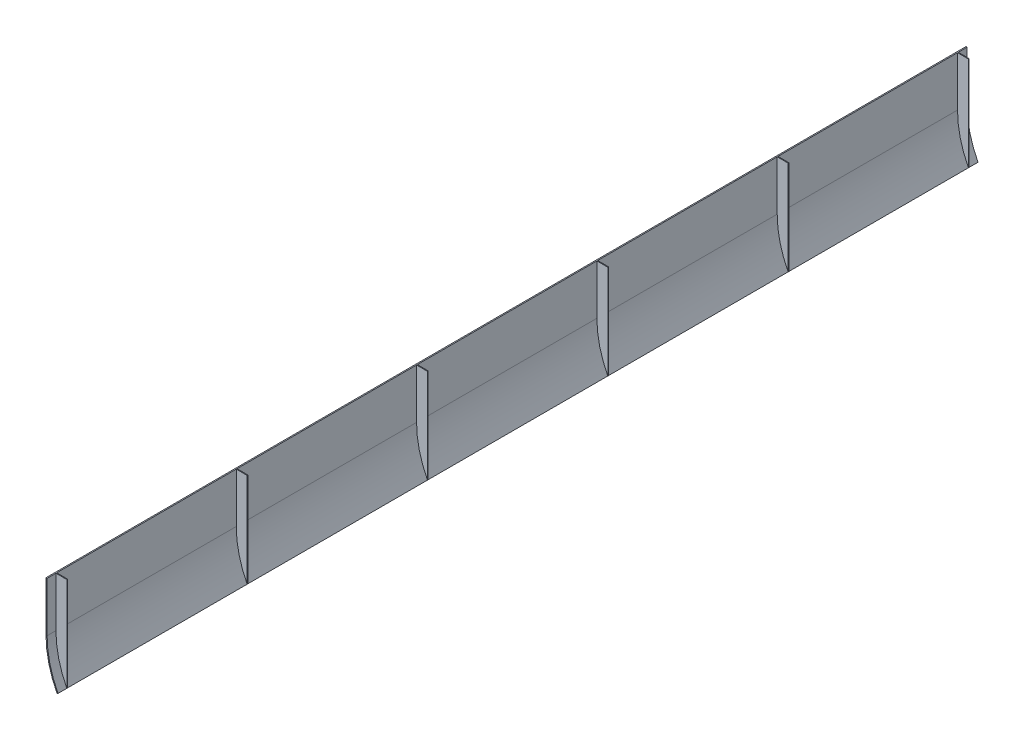
ISO-10303-21;
HEADER;
FILE_DESCRIPTION(('STEP AP214'),'2;1');
FILE_NAME('part.step','',(''),(''),'','','');
FILE_SCHEMA(('AUTOMOTIVE_DESIGN { 1 0 10303 214 1 1 1 1 }'));
ENDSEC;
DATA;
#1=APPLICATION_CONTEXT('core data for automotive mechanical design processes');
#2=APPLICATION_PROTOCOL_DEFINITION('international standard','automotive_design',2000,#1);
#3=PRODUCT_CONTEXT('',#1,'mechanical');
#4=PRODUCT('Part','Part','',(#3));
#5=PRODUCT_RELATED_PRODUCT_CATEGORY('part','',(#4));
#6=PRODUCT_DEFINITION_FORMATION('','',#4);
#7=PRODUCT_DEFINITION_CONTEXT('part definition',#1,'design');
#8=PRODUCT_DEFINITION('design','',#6,#7);
#9=PRODUCT_DEFINITION_SHAPE('','',#8);
#10=(LENGTH_UNIT() NAMED_UNIT(*) SI_UNIT(.MILLI.,.METRE.));
#11=(NAMED_UNIT(*) PLANE_ANGLE_UNIT() SI_UNIT($,.RADIAN.));
#12=(NAMED_UNIT(*) SI_UNIT($,.STERADIAN.) SOLID_ANGLE_UNIT());
#13=UNCERTAINTY_MEASURE_WITH_UNIT(LENGTH_MEASURE(1.E-05),#10,'distance_accuracy_value','');
#14=(GEOMETRIC_REPRESENTATION_CONTEXT(3) GLOBAL_UNCERTAINTY_ASSIGNED_CONTEXT((#13)) GLOBAL_UNIT_ASSIGNED_CONTEXT((#10,
#11,#12)) REPRESENTATION_CONTEXT('',''));
#15=CARTESIAN_POINT('',(0.,0.,0.));
#16=DIRECTION('',(0.,0.,1.));
#17=DIRECTION('',(1.,0.,0.));
#18=AXIS2_PLACEMENT_3D('',#15,#16,#17);
#19=CARTESIAN_POINT('',(234.72,122.4058822116,0.));
#20=DIRECTION('',(0.,0.,1.));
#21=DIRECTION('',(1.,0.,0.));
#22=AXIS2_PLACEMENT_3D('',#19,#20,#21);
#23=CYLINDRICAL_SURFACE('',#22,261.72);
#24=CARTESIAN_POINT('',(234.72,122.4058822116,24.));
#25=DIRECTION('',(0.,0.,-1.));
#26=DIRECTION('',(-1.,0.,0.));
#27=AXIS2_PLACEMENT_3D('',#24,#25,#26);
#28=CIRCLE('',#27,261.72);
#29=CARTESIAN_POINT('',(-27.,122.4058822116,24.));
#30=VERTEX_POINT('',#29);
#31=CARTESIAN_POINT('',(2.66001813236624,1.38719268145519,24.));
#32=VERTEX_POINT('',#31);
#33=EDGE_CURVE('E328',#30,#32,#28,.F.);
#34=ORIENTED_EDGE('',*,*,#33,.T.);
#35=DIRECTION('',(0.,0.,1.));
#36=VECTOR('',#35,1.);
#37=CARTESIAN_POINT('',(2.66001813236624,1.38719268145519,0.));
#38=LINE('',#37,#36);
#39=CARTESIAN_POINT('',(2.66001813236624,1.38719268145519,0.));
#40=VERTEX_POINT('',#39);
#41=EDGE_CURVE('E276',#40,#32,#38,.T.);
#42=ORIENTED_EDGE('',*,*,#41,.F.);
#43=CARTESIAN_POINT('',(234.72,122.4058822116,0.));
#44=DIRECTION('',(0.,0.,1.));
#45=DIRECTION('',(1.,0.,0.));
#46=AXIS2_PLACEMENT_3D('',#43,#44,#45);
#47=CIRCLE('',#46,261.72);
#48=CARTESIAN_POINT('',(-27.,122.4058822116,0.));
#49=VERTEX_POINT('',#48);
#50=EDGE_CURVE('E273',#40,#49,#47,.F.);
#51=ORIENTED_EDGE('',*,*,#50,.T.);
#52=DIRECTION('',(0.,0.,1.));
#53=VECTOR('',#52,1.);
#54=CARTESIAN_POINT('',(-27.,122.4058822116,0.));
#55=LINE('',#54,#53);
#56=EDGE_CURVE('E272',#49,#30,#55,.T.);
#57=ORIENTED_EDGE('',*,*,#56,.T.);
#58=EDGE_LOOP('',(#34,#42,#51,#57));
#59=FACE_BOUND('',#58,.T.);
#60=ADVANCED_FACE('F36',(#59),#23,.F.);
#61=CARTESIAN_POINT('',(-27.,122.4058822116,0.));
#62=DIRECTION('',(1.,0.,0.));
#63=DIRECTION('',(0.,1.,0.));
#64=AXIS2_PLACEMENT_3D('',#61,#62,#63);
#65=PLANE('',#64);
#66=DIRECTION('',(0.,1.,0.));
#67=VECTOR('',#66,1.);
#68=CARTESIAN_POINT('',(-27.,-0.002000000000002,24.));
#69=LINE('',#68,#67);
#70=CARTESIAN_POINT('',(-27.,257.4058822116,24.));
#71=VERTEX_POINT('',#70);
#72=EDGE_CURVE('E241',#30,#71,#69,.T.);
#73=ORIENTED_EDGE('',*,*,#72,.F.);
#74=ORIENTED_EDGE('',*,*,#56,.F.);
#75=DIRECTION('',(0.,1.,0.));
#76=VECTOR('',#75,1.);
#77=CARTESIAN_POINT('',(-27.,122.4058822116,0.));
#78=LINE('',#77,#76);
#79=CARTESIAN_POINT('',(-27.,257.4058822116,0.));
#80=VERTEX_POINT('',#79);
#81=EDGE_CURVE('E269',#49,#80,#78,.T.);
#82=ORIENTED_EDGE('',*,*,#81,.T.);
#83=DIRECTION('',(0.,0.,1.));
#84=VECTOR('',#83,1.);
#85=CARTESIAN_POINT('',(-27.,257.4058822116,0.));
#86=LINE('',#85,#84);
#87=EDGE_CURVE('E258',#80,#71,#86,.T.);
#88=ORIENTED_EDGE('',*,*,#87,.T.);
#89=EDGE_LOOP('',(#73,#74,#82,#88));
#90=FACE_BOUND('',#89,.T.);
#91=ADVANCED_FACE('F314',(#90),#65,.T.);
#92=CARTESIAN_POINT('',(234.72,122.4058822116,25.9999999999998));
#93=DIRECTION('',(0.,0.,1.));
#94=DIRECTION('',(1.,0.,0.));
#95=AXIS2_PLACEMENT_3D('',#92,#93,#94);
#96=CIRCLE('',#95,261.72);
#97=CARTESIAN_POINT('',(2.66001813236624,1.38719268145519,25.9999999999998));
#98=VERTEX_POINT('',#97);
#99=CARTESIAN_POINT('',(-27.,122.4058822116,25.9999999999998));
#100=VERTEX_POINT('',#99);
#101=EDGE_CURVE('E251',#98,#100,#96,.F.);
#102=ORIENTED_EDGE('',*,*,#101,.T.);
#103=CARTESIAN_POINT('',(-27.,122.4058822116,514.));
#104=VERTEX_POINT('',#103);
#105=EDGE_CURVE('E250',#100,#104,#55,.T.);
#106=ORIENTED_EDGE('',*,*,#105,.T.);
#107=CARTESIAN_POINT('',(234.72,122.4058822116,514.));
#108=DIRECTION('',(0.,0.,-1.));
#109=DIRECTION('',(-1.,0.,0.));
#110=AXIS2_PLACEMENT_3D('',#107,#108,#109);
#111=CIRCLE('',#110,261.72);
#112=CARTESIAN_POINT('',(2.66001813236624,1.38719268145519,514.));
#113=VERTEX_POINT('',#112);
#114=EDGE_CURVE('E350',#104,#113,#111,.F.);
#115=ORIENTED_EDGE('',*,*,#114,.T.);
#116=EDGE_CURVE('E279',#98,#113,#38,.T.);
#117=ORIENTED_EDGE('',*,*,#116,.F.);
#118=EDGE_LOOP('',(#102,#106,#115,#117));
#119=FACE_BOUND('',#118,.T.);
#120=ADVANCED_FACE('F494',(#119),#23,.F.);
#121=DIRECTION('',(0.,1.,0.));
#122=VECTOR('',#121,1.);
#123=CARTESIAN_POINT('',(-27.,-0.002000000000002,25.9999999999998));
#124=LINE('',#123,#122);
#125=CARTESIAN_POINT('',(-27.,257.4058822116,25.9999999999998));
#126=VERTEX_POINT('',#125);
#127=EDGE_CURVE('E236',#100,#126,#124,.T.);
#128=ORIENTED_EDGE('',*,*,#127,.T.);
#129=CARTESIAN_POINT('',(-27.,257.4058822116,514.));
#130=VERTEX_POINT('',#129);
#131=EDGE_CURVE('E248',#126,#130,#86,.T.);
#132=ORIENTED_EDGE('',*,*,#131,.T.);
#133=DIRECTION('',(0.,1.,0.));
#134=VECTOR('',#133,1.);
#135=CARTESIAN_POINT('',(-27.,-0.002000000000002,514.));
#136=LINE('',#135,#134);
#137=EDGE_CURVE('E338',#104,#130,#136,.T.);
#138=ORIENTED_EDGE('',*,*,#137,.F.);
#139=ORIENTED_EDGE('',*,*,#105,.F.);
#140=EDGE_LOOP('',(#128,#132,#138,#139));
#141=FACE_BOUND('',#140,.T.);
#142=ADVANCED_FACE('F246',(#141),#65,.T.);
#143=CARTESIAN_POINT('',(234.72,122.4058822116,516.));
#144=DIRECTION('',(0.,0.,1.));
#145=DIRECTION('',(1.,0.,0.));
#146=AXIS2_PLACEMENT_3D('',#143,#144,#145);
#147=CIRCLE('',#146,261.72);
#148=CARTESIAN_POINT('',(2.66001813236624,1.38719268145519,516.));
#149=VERTEX_POINT('',#148);
#150=CARTESIAN_POINT('',(-27.,122.4058822116,516.));
#151=VERTEX_POINT('',#150);
#152=EDGE_CURVE('E349',#149,#151,#147,.F.);
#153=ORIENTED_EDGE('',*,*,#152,.T.);
#154=CARTESIAN_POINT('',(-27.,122.4058822116,1004.));
#155=VERTEX_POINT('',#154);
#156=EDGE_CURVE('E495',#151,#155,#55,.T.);
#157=ORIENTED_EDGE('',*,*,#156,.T.);
#158=CARTESIAN_POINT('',(234.72,122.4058822116,1004.));
#159=DIRECTION('',(0.,0.,-1.));
#160=DIRECTION('',(-1.,0.,0.));
#161=AXIS2_PLACEMENT_3D('',#158,#159,#160);
#162=CIRCLE('',#161,261.72);
#163=CARTESIAN_POINT('',(2.66001813236624,1.38719268145519,1004.));
#164=VERTEX_POINT('',#163);
#165=EDGE_CURVE('E378',#155,#164,#162,.F.);
#166=ORIENTED_EDGE('',*,*,#165,.T.);
#167=EDGE_CURVE('E481',#149,#164,#38,.T.);
#168=ORIENTED_EDGE('',*,*,#167,.F.);
#169=EDGE_LOOP('',(#153,#157,#166,#168));
#170=FACE_BOUND('',#169,.T.);
#171=ADVANCED_FACE('F549',(#170),#23,.F.);
#172=DIRECTION('',(0.,1.,0.));
#173=VECTOR('',#172,1.);
#174=CARTESIAN_POINT('',(-27.,-0.002000000000002,516.));
#175=LINE('',#174,#173);
#176=CARTESIAN_POINT('',(-27.,257.4058822116,516.));
#177=VERTEX_POINT('',#176);
#178=EDGE_CURVE('E346',#151,#177,#175,.T.);
#179=ORIENTED_EDGE('',*,*,#178,.T.);
#180=CARTESIAN_POINT('',(-27.,257.4058822116,1004.));
#181=VERTEX_POINT('',#180);
#182=EDGE_CURVE('E259',#177,#181,#86,.T.);
#183=ORIENTED_EDGE('',*,*,#182,.T.);
#184=DIRECTION('',(0.,1.,0.));
#185=VECTOR('',#184,1.);
#186=CARTESIAN_POINT('',(-27.,-0.002000000000002,1004.));
#187=LINE('',#186,#185);
#188=EDGE_CURVE('E362',#155,#181,#187,.T.);
#189=ORIENTED_EDGE('',*,*,#188,.F.);
#190=ORIENTED_EDGE('',*,*,#156,.F.);
#191=EDGE_LOOP('',(#179,#183,#189,#190));
#192=FACE_BOUND('',#191,.T.);
#193=ADVANCED_FACE('F573',(#192),#65,.T.);
#194=CARTESIAN_POINT('',(234.72,122.4058822116,1006.));
#195=DIRECTION('',(0.,0.,1.));
#196=DIRECTION('',(1.,0.,0.));
#197=AXIS2_PLACEMENT_3D('',#194,#195,#196);
#198=CIRCLE('',#197,261.72);
#199=CARTESIAN_POINT('',(2.66001813236624,1.38719268145519,1006.));
#200=VERTEX_POINT('',#199);
#201=CARTESIAN_POINT('',(-27.,122.4058822116,1006.));
#202=VERTEX_POINT('',#201);
#203=EDGE_CURVE('E377',#200,#202,#198,.F.);
#204=ORIENTED_EDGE('',*,*,#203,.T.);
#205=CARTESIAN_POINT('',(-27.,122.4058822116,1494.));
#206=VERTEX_POINT('',#205);
#207=EDGE_CURVE('E496',#202,#206,#55,.T.);
#208=ORIENTED_EDGE('',*,*,#207,.T.);
#209=CARTESIAN_POINT('',(234.72,122.4058822116,1494.));
#210=DIRECTION('',(0.,0.,-1.));
#211=DIRECTION('',(-1.,0.,0.));
#212=AXIS2_PLACEMENT_3D('',#209,#210,#211);
#213=CIRCLE('',#212,261.72);
#214=CARTESIAN_POINT('',(2.66001813236624,1.38719268145519,1494.));
#215=VERTEX_POINT('',#214);
#216=EDGE_CURVE('E406',#206,#215,#213,.F.);
#217=ORIENTED_EDGE('',*,*,#216,.T.);
#218=EDGE_CURVE('E478',#200,#215,#38,.T.);
#219=ORIENTED_EDGE('',*,*,#218,.F.);
#220=EDGE_LOOP('',(#204,#208,#217,#219));
#221=FACE_BOUND('',#220,.T.);
#222=ADVANCED_FACE('F568',(#221),#23,.F.);
#223=DIRECTION('',(0.,1.,0.));
#224=VECTOR('',#223,1.);
#225=CARTESIAN_POINT('',(-27.,-0.002000000000002,1006.));
#226=LINE('',#225,#224);
#227=CARTESIAN_POINT('',(-27.,257.4058822116,1006.));
#228=VERTEX_POINT('',#227);
#229=EDGE_CURVE('E374',#202,#228,#226,.T.);
#230=ORIENTED_EDGE('',*,*,#229,.T.);
#231=CARTESIAN_POINT('',(-27.,257.4058822116,1494.));
#232=VERTEX_POINT('',#231);
#233=EDGE_CURVE('E264',#228,#232,#86,.T.);
#234=ORIENTED_EDGE('',*,*,#233,.T.);
#235=DIRECTION('',(0.,1.,0.));
#236=VECTOR('',#235,1.);
#237=CARTESIAN_POINT('',(-27.,-0.002000000000002,1494.));
#238=LINE('',#237,#236);
#239=EDGE_CURVE('E390',#206,#232,#238,.T.);
#240=ORIENTED_EDGE('',*,*,#239,.F.);
#241=ORIENTED_EDGE('',*,*,#207,.F.);
#242=EDGE_LOOP('',(#230,#234,#240,#241));
#243=FACE_BOUND('',#242,.T.);
#244=ADVANCED_FACE('F566',(#243),#65,.T.);
#245=CARTESIAN_POINT('',(234.72,122.4058822116,1496.));
#246=DIRECTION('',(0.,0.,1.));
#247=DIRECTION('',(1.,0.,0.));
#248=AXIS2_PLACEMENT_3D('',#245,#246,#247);
#249=CIRCLE('',#248,261.72);
#250=CARTESIAN_POINT('',(2.66001813236624,1.38719268145519,1496.));
#251=VERTEX_POINT('',#250);
#252=CARTESIAN_POINT('',(-27.,122.4058822116,1496.));
#253=VERTEX_POINT('',#252);
#254=EDGE_CURVE('E405',#251,#253,#249,.F.);
#255=ORIENTED_EDGE('',*,*,#254,.T.);
#256=CARTESIAN_POINT('',(-27.,122.4058822116,1984.));
#257=VERTEX_POINT('',#256);
#258=EDGE_CURVE('E500',#253,#257,#55,.T.);
#259=ORIENTED_EDGE('',*,*,#258,.T.);
#260=CARTESIAN_POINT('',(234.72,122.4058822116,1984.));
#261=DIRECTION('',(0.,0.,-1.));
#262=DIRECTION('',(-1.,0.,0.));
#263=AXIS2_PLACEMENT_3D('',#260,#261,#262);
#264=CIRCLE('',#263,261.72);
#265=CARTESIAN_POINT('',(2.66001813236624,1.38719268145519,1984.));
#266=VERTEX_POINT('',#265);
#267=EDGE_CURVE('E434',#257,#266,#264,.F.);
#268=ORIENTED_EDGE('',*,*,#267,.T.);
#269=EDGE_CURVE('E476',#251,#266,#38,.T.);
#270=ORIENTED_EDGE('',*,*,#269,.F.);
#271=EDGE_LOOP('',(#255,#259,#268,#270));
#272=FACE_BOUND('',#271,.T.);
#273=ADVANCED_FACE('F559',(#272),#23,.F.);
#274=DIRECTION('',(0.,1.,0.));
#275=VECTOR('',#274,1.);
#276=CARTESIAN_POINT('',(-27.,-0.002000000000002,1496.));
#277=LINE('',#276,#275);
#278=CARTESIAN_POINT('',(-27.,257.4058822116,1496.));
#279=VERTEX_POINT('',#278);
#280=EDGE_CURVE('E402',#253,#279,#277,.T.);
#281=ORIENTED_EDGE('',*,*,#280,.T.);
#282=CARTESIAN_POINT('',(-27.,257.4058822116,1984.));
#283=VERTEX_POINT('',#282);
#284=EDGE_CURVE('E602',#279,#283,#86,.T.);
#285=ORIENTED_EDGE('',*,*,#284,.T.);
#286=DIRECTION('',(0.,1.,0.));
#287=VECTOR('',#286,1.);
#288=CARTESIAN_POINT('',(-27.,-0.002000000000002,1984.));
#289=LINE('',#288,#287);
#290=EDGE_CURVE('E418',#257,#283,#289,.T.);
#291=ORIENTED_EDGE('',*,*,#290,.F.);
#292=ORIENTED_EDGE('',*,*,#258,.F.);
#293=EDGE_LOOP('',(#281,#285,#291,#292));
#294=FACE_BOUND('',#293,.T.);
#295=ADVANCED_FACE('F558',(#294),#65,.T.);
#296=CARTESIAN_POINT('',(234.72,122.4058822116,1986.));
#297=DIRECTION('',(0.,0.,1.));
#298=DIRECTION('',(1.,0.,0.));
#299=AXIS2_PLACEMENT_3D('',#296,#297,#298);
#300=CIRCLE('',#299,261.72);
#301=CARTESIAN_POINT('',(2.66001813236624,1.38719268145519,1986.));
#302=VERTEX_POINT('',#301);
#303=CARTESIAN_POINT('',(-27.,122.4058822116,1986.));
#304=VERTEX_POINT('',#303);
#305=EDGE_CURVE('E433',#302,#304,#300,.F.);
#306=ORIENTED_EDGE('',*,*,#305,.T.);
#307=CARTESIAN_POINT('',(-27.,122.4058822116,2474.));
#308=VERTEX_POINT('',#307);
#309=EDGE_CURVE('E504',#304,#308,#55,.T.);
#310=ORIENTED_EDGE('',*,*,#309,.T.);
#311=CARTESIAN_POINT('',(234.72,122.4058822116,2474.));
#312=DIRECTION('',(0.,0.,-1.));
#313=DIRECTION('',(-1.,0.,0.));
#314=AXIS2_PLACEMENT_3D('',#311,#312,#313);
#315=CIRCLE('',#314,261.72);
#316=CARTESIAN_POINT('',(2.66001813236624,1.38719268145519,2474.));
#317=VERTEX_POINT('',#316);
#318=EDGE_CURVE('E296',#308,#317,#315,.F.);
#319=ORIENTED_EDGE('',*,*,#318,.T.);
#320=EDGE_CURVE('E474',#302,#317,#38,.T.);
#321=ORIENTED_EDGE('',*,*,#320,.F.);
#322=EDGE_LOOP('',(#306,#310,#319,#321));
#323=FACE_BOUND('',#322,.T.);
#324=ADVANCED_FACE('F551',(#323),#23,.F.);
#325=DIRECTION('',(0.,1.,0.));
#326=VECTOR('',#325,1.);
#327=CARTESIAN_POINT('',(-27.,-0.002000000000002,1986.));
#328=LINE('',#327,#326);
#329=CARTESIAN_POINT('',(-27.,257.4058822116,1986.));
#330=VERTEX_POINT('',#329);
#331=EDGE_CURVE('E430',#304,#330,#328,.T.);
#332=ORIENTED_EDGE('',*,*,#331,.T.);
#333=CARTESIAN_POINT('',(-27.,257.4058822116,2474.));
#334=VERTEX_POINT('',#333);
#335=EDGE_CURVE('E520',#330,#334,#86,.T.);
#336=ORIENTED_EDGE('',*,*,#335,.T.);
#337=DIRECTION('',(0.,1.,0.));
#338=VECTOR('',#337,1.);
#339=CARTESIAN_POINT('',(-27.,-0.002000000000002,2474.));
#340=LINE('',#339,#338);
#341=EDGE_CURVE('E446',#308,#334,#340,.T.);
#342=ORIENTED_EDGE('',*,*,#341,.F.);
#343=ORIENTED_EDGE('',*,*,#309,.F.);
#344=EDGE_LOOP('',(#332,#336,#342,#343));
#345=FACE_BOUND('',#344,.T.);
#346=ADVANCED_FACE('F556',(#345),#65,.T.);
#347=CARTESIAN_POINT('',(-30.,122.4058822116,0.));
#348=DIRECTION('',(0.,0.,-1.));
#349=DIRECTION('',(0.,1.,0.));
#350=AXIS2_PLACEMENT_3D('',#347,#348,#349);
#351=PLANE('',#350);
#352=ORIENTED_EDGE('',*,*,#81,.F.);
#353=ORIENTED_EDGE('',*,*,#50,.F.);
#354=DIRECTION('',(0.886672710788758,0.46239756048504,0.));
#355=VECTOR('',#354,1.);
#356=CARTESIAN_POINT('',(0.,0.,0.));
#357=LINE('',#356,#355);
#358=CARTESIAN_POINT('',(0.,0.,0.));
#359=VERTEX_POINT('',#358);
#360=EDGE_CURVE('E11',#359,#40,#357,.T.);
#361=ORIENTED_EDGE('',*,*,#360,.F.);
#362=CARTESIAN_POINT('',(234.72,122.4058822116,0.));
#363=DIRECTION('',(0.,0.,-1.));
#364=DIRECTION('',(-1.,0.,0.));
#365=AXIS2_PLACEMENT_3D('',#362,#363,#364);
#366=CIRCLE('',#365,264.72);
#367=CARTESIAN_POINT('',(-30.,122.4058822116,0.));
#368=VERTEX_POINT('',#367);
#369=EDGE_CURVE('E281',#359,#368,#366,.T.);
#370=ORIENTED_EDGE('',*,*,#369,.T.);
#371=DIRECTION('',(0.,1.,0.));
#372=VECTOR('',#371,1.);
#373=CARTESIAN_POINT('',(-30.,122.4058822116,0.));
#374=LINE('',#373,#372);
#375=CARTESIAN_POINT('',(-30.,257.4058822116,0.));
#376=VERTEX_POINT('',#375);
#377=EDGE_CURVE('E285',#368,#376,#374,.T.);
#378=ORIENTED_EDGE('',*,*,#377,.T.);
#379=DIRECTION('',(1.,0.,0.));
#380=VECTOR('',#379,1.);
#381=CARTESIAN_POINT('',(-30.,257.4058822116,0.));
#382=LINE('',#381,#380);
#383=EDGE_CURVE('E45',#376,#80,#382,.T.);
#384=ORIENTED_EDGE('',*,*,#383,.T.);
#385=EDGE_LOOP('',(#352,#353,#361,#370,#378,#384));
#386=FACE_BOUND('',#385,.T.);
#387=ADVANCED_FACE('F306',(#386),#351,.T.);
#388=CARTESIAN_POINT('',(-30.,257.4058822116,0.));
#389=DIRECTION('',(0.,1.,0.));
#390=DIRECTION('',(0.,0.,1.));
#391=AXIS2_PLACEMENT_3D('',#388,#389,#390);
#392=PLANE('',#391);
#393=ORIENTED_EDGE('',*,*,#383,.F.);
#394=DIRECTION('',(0.,0.,1.));
#395=VECTOR('',#394,1.);
#396=CARTESIAN_POINT('',(-30.,257.4058822116,0.));
#397=LINE('',#396,#395);
#398=CARTESIAN_POINT('',(-30.,257.4058822116,2500.));
#399=VERTEX_POINT('',#398);
#400=EDGE_CURVE('E288',#376,#399,#397,.T.);
#401=ORIENTED_EDGE('',*,*,#400,.T.);
#402=DIRECTION('',(1.,0.,0.));
#403=VECTOR('',#402,1.);
#404=CARTESIAN_POINT('',(-30.,257.4058822116,2500.));
#405=LINE('',#404,#403);
#406=CARTESIAN_POINT('',(-27.,257.4058822116,2500.));
#407=VERTEX_POINT('',#406);
#408=EDGE_CURVE('E302',#399,#407,#405,.T.);
#409=ORIENTED_EDGE('',*,*,#408,.T.);
#410=CARTESIAN_POINT('',(-27.,257.4058822116,2476.));
#411=VERTEX_POINT('',#410);
#412=EDGE_CURVE('E263',#411,#407,#86,.T.);
#413=ORIENTED_EDGE('',*,*,#412,.F.);
#414=DIRECTION('',(1.,0.,0.));
#415=VECTOR('',#414,1.);
#416=CARTESIAN_POINT('',(-27.,257.4058822116,2476.));
#417=LINE('',#416,#415);
#418=CARTESIAN_POINT('',(2.66001813236624,257.4058822116,2476.));
#419=VERTEX_POINT('',#418);
#420=EDGE_CURVE('E443',#411,#419,#417,.T.);
#421=ORIENTED_EDGE('',*,*,#420,.T.);
#422=DIRECTION('',(0.,0.,-1.));
#423=VECTOR('',#422,1.);
#424=CARTESIAN_POINT('',(2.66001813236624,257.4058822116,2476.));
#425=LINE('',#424,#423);
#426=CARTESIAN_POINT('',(2.66001813236624,257.4058822116,2474.));
#427=VERTEX_POINT('',#426);
#428=EDGE_CURVE('E447',#419,#427,#425,.T.);
#429=ORIENTED_EDGE('',*,*,#428,.T.);
#430=DIRECTION('',(-1.,0.,0.));
#431=VECTOR('',#430,1.);
#432=CARTESIAN_POINT('',(-27.,257.4058822116,2474.));
#433=LINE('',#432,#431);
#434=EDGE_CURVE('E437',#427,#334,#433,.T.);
#435=ORIENTED_EDGE('',*,*,#434,.T.);
#436=ORIENTED_EDGE('',*,*,#335,.F.);
#437=DIRECTION('',(1.,0.,0.));
#438=VECTOR('',#437,1.);
#439=CARTESIAN_POINT('',(-27.,257.4058822116,1986.));
#440=LINE('',#439,#438);
#441=CARTESIAN_POINT('',(2.66001813236624,257.4058822116,1986.));
#442=VERTEX_POINT('',#441);
#443=EDGE_CURVE('E415',#330,#442,#440,.T.);
#444=ORIENTED_EDGE('',*,*,#443,.T.);
#445=DIRECTION('',(0.,0.,-1.));
#446=VECTOR('',#445,1.);
#447=CARTESIAN_POINT('',(2.66001813236624,257.4058822116,1986.));
#448=LINE('',#447,#446);
#449=CARTESIAN_POINT('',(2.66001813236624,257.4058822116,1984.));
#450=VERTEX_POINT('',#449);
#451=EDGE_CURVE('E419',#442,#450,#448,.T.);
#452=ORIENTED_EDGE('',*,*,#451,.T.);
#453=DIRECTION('',(-1.,0.,0.));
#454=VECTOR('',#453,1.);
#455=CARTESIAN_POINT('',(-27.,257.4058822116,1984.));
#456=LINE('',#455,#454);
#457=EDGE_CURVE('E409',#450,#283,#456,.T.);
#458=ORIENTED_EDGE('',*,*,#457,.T.);
#459=ORIENTED_EDGE('',*,*,#284,.F.);
#460=DIRECTION('',(1.,0.,0.));
#461=VECTOR('',#460,1.);
#462=CARTESIAN_POINT('',(-27.,257.4058822116,1496.));
#463=LINE('',#462,#461);
#464=CARTESIAN_POINT('',(2.66001813236624,257.4058822116,1496.));
#465=VERTEX_POINT('',#464);
#466=EDGE_CURVE('E387',#279,#465,#463,.T.);
#467=ORIENTED_EDGE('',*,*,#466,.T.);
#468=DIRECTION('',(0.,0.,-1.));
#469=VECTOR('',#468,1.);
#470=CARTESIAN_POINT('',(2.66001813236624,257.4058822116,1496.));
#471=LINE('',#470,#469);
#472=CARTESIAN_POINT('',(2.66001813236624,257.4058822116,1494.));
#473=VERTEX_POINT('',#472);
#474=EDGE_CURVE('E391',#465,#473,#471,.T.);
#475=ORIENTED_EDGE('',*,*,#474,.T.);
#476=DIRECTION('',(-1.,0.,0.));
#477=VECTOR('',#476,1.);
#478=CARTESIAN_POINT('',(-27.,257.4058822116,1494.));
#479=LINE('',#478,#477);
#480=EDGE_CURVE('E381',#473,#232,#479,.T.);
#481=ORIENTED_EDGE('',*,*,#480,.T.);
#482=ORIENTED_EDGE('',*,*,#233,.F.);
#483=DIRECTION('',(1.,0.,0.));
#484=VECTOR('',#483,1.);
#485=CARTESIAN_POINT('',(-27.,257.4058822116,1006.));
#486=LINE('',#485,#484);
#487=CARTESIAN_POINT('',(2.66001813236624,257.4058822116,1006.));
#488=VERTEX_POINT('',#487);
#489=EDGE_CURVE('E359',#228,#488,#486,.T.);
#490=ORIENTED_EDGE('',*,*,#489,.T.);
#491=DIRECTION('',(0.,0.,-1.));
#492=VECTOR('',#491,1.);
#493=CARTESIAN_POINT('',(2.66001813236624,257.4058822116,1006.));
#494=LINE('',#493,#492);
#495=CARTESIAN_POINT('',(2.66001813236624,257.4058822116,1004.));
#496=VERTEX_POINT('',#495);
#497=EDGE_CURVE('E363',#488,#496,#494,.T.);
#498=ORIENTED_EDGE('',*,*,#497,.T.);
#499=DIRECTION('',(-1.,0.,0.));
#500=VECTOR('',#499,1.);
#501=CARTESIAN_POINT('',(-27.,257.4058822116,1004.));
#502=LINE('',#501,#500);
#503=EDGE_CURVE('E353',#496,#181,#502,.T.);
#504=ORIENTED_EDGE('',*,*,#503,.T.);
#505=ORIENTED_EDGE('',*,*,#182,.F.);
#506=DIRECTION('',(1.,0.,0.));
#507=VECTOR('',#506,1.);
#508=CARTESIAN_POINT('',(-27.,257.4058822116,516.));
#509=LINE('',#508,#507);
#510=CARTESIAN_POINT('',(2.66001813236624,257.4058822116,516.));
#511=VERTEX_POINT('',#510);
#512=EDGE_CURVE('E335',#177,#511,#509,.T.);
#513=ORIENTED_EDGE('',*,*,#512,.T.);
#514=DIRECTION('',(0.,0.,-1.));
#515=VECTOR('',#514,1.);
#516=CARTESIAN_POINT('',(2.66001813236624,257.4058822116,516.));
#517=LINE('',#516,#515);
#518=CARTESIAN_POINT('',(2.66001813236624,257.4058822116,514.));
#519=VERTEX_POINT('',#518);
#520=EDGE_CURVE('E339',#511,#519,#517,.T.);
#521=ORIENTED_EDGE('',*,*,#520,.T.);
#522=DIRECTION('',(-1.,0.,0.));
#523=VECTOR('',#522,1.);
#524=CARTESIAN_POINT('',(-27.,257.4058822116,514.));
#525=LINE('',#524,#523);
#526=EDGE_CURVE('E257',#519,#130,#525,.T.);
#527=ORIENTED_EDGE('',*,*,#526,.T.);
#528=ORIENTED_EDGE('',*,*,#131,.F.);
#529=DIRECTION('',(1.,0.,0.));
#530=VECTOR('',#529,1.);
#531=CARTESIAN_POINT('',(-27.,257.4058822116,25.9999999999998));
#532=LINE('',#531,#530);
#533=CARTESIAN_POINT('',(2.66001813236624,257.4058822116,25.9999999999998));
#534=VERTEX_POINT('',#533);
#535=EDGE_CURVE('E233',#126,#534,#532,.T.);
#536=ORIENTED_EDGE('',*,*,#535,.T.);
#537=DIRECTION('',(0.,0.,-1.));
#538=VECTOR('',#537,1.);
#539=CARTESIAN_POINT('',(2.66001813236624,257.4058822116,25.9999999999998));
#540=LINE('',#539,#538);
#541=CARTESIAN_POINT('',(2.66001813236624,257.4058822116,24.));
#542=VERTEX_POINT('',#541);
#543=EDGE_CURVE('E242',#534,#542,#540,.T.);
#544=ORIENTED_EDGE('',*,*,#543,.T.);
#545=DIRECTION('',(-1.,0.,0.));
#546=VECTOR('',#545,1.);
#547=CARTESIAN_POINT('',(-27.,257.4058822116,24.));
#548=LINE('',#547,#546);
#549=EDGE_CURVE('E318',#542,#71,#548,.T.);
#550=ORIENTED_EDGE('',*,*,#549,.T.);
#551=ORIENTED_EDGE('',*,*,#87,.F.);
#552=EDGE_LOOP('',(#393,#401,#409,#413,#421,#429,#435,#436,#444,#452,#458,#459,#467,#475,#481,
#482,#490,#498,#504,#505,#513,#521,#527,#528,#536,#544,#550,#551));
#553=FACE_BOUND('',#552,.T.);
#554=ADVANCED_FACE('F254',(#553),#392,.T.);
#555=CARTESIAN_POINT('',(234.72,122.4058822116,2500.));
#556=DIRECTION('',(0.,0.,1.));
#557=DIRECTION('',(1.,0.,0.));
#558=AXIS2_PLACEMENT_3D('',#555,#556,#557);
#559=PLANE('',#558);
#560=CARTESIAN_POINT('',(234.72,122.4058822116,2500.));
#561=DIRECTION('',(0.,0.,1.));
#562=DIRECTION('',(1.,0.,0.));
#563=AXIS2_PLACEMENT_3D('',#560,#561,#562);
#564=CIRCLE('',#563,261.72);
#565=CARTESIAN_POINT('',(2.66001813236624,1.38719268145519,2500.));
#566=VERTEX_POINT('',#565);
#567=CARTESIAN_POINT('',(-27.,122.4058822116,2500.));
#568=VERTEX_POINT('',#567);
#569=EDGE_CURVE('E262',#566,#568,#564,.F.);
#570=ORIENTED_EDGE('',*,*,#569,.T.);
#571=DIRECTION('',(0.,1.,0.));
#572=VECTOR('',#571,1.);
#573=CARTESIAN_POINT('',(-27.,122.4058822116,2500.));
#574=LINE('',#573,#572);
#575=EDGE_CURVE('E267',#568,#407,#574,.T.);
#576=ORIENTED_EDGE('',*,*,#575,.T.);
#577=ORIENTED_EDGE('',*,*,#408,.F.);
#578=DIRECTION('',(0.,1.,0.));
#579=VECTOR('',#578,1.);
#580=CARTESIAN_POINT('',(-30.,122.4058822116,2500.));
#581=LINE('',#580,#579);
#582=CARTESIAN_POINT('',(-30.,122.4058822116,2500.));
#583=VERTEX_POINT('',#582);
#584=EDGE_CURVE('E293',#583,#399,#581,.T.);
#585=ORIENTED_EDGE('',*,*,#584,.F.);
#586=CARTESIAN_POINT('',(234.72,122.4058822116,2500.));
#587=DIRECTION('',(0.,0.,-1.));
#588=DIRECTION('',(-1.,0.,0.));
#589=AXIS2_PLACEMENT_3D('',#586,#587,#588);
#590=CIRCLE('',#589,264.72);
#591=CARTESIAN_POINT('',(0.,0.,2500.));
#592=VERTEX_POINT('',#591);
#593=EDGE_CURVE('E290',#592,#583,#590,.T.);
#594=ORIENTED_EDGE('',*,*,#593,.F.);
#595=DIRECTION('',(0.886672710788758,0.46239756048504,0.));
#596=VECTOR('',#595,1.);
#597=CARTESIAN_POINT('',(0.,0.,2500.));
#598=LINE('',#597,#596);
#599=EDGE_CURVE('E40',#592,#566,#598,.T.);
#600=ORIENTED_EDGE('',*,*,#599,.T.);
#601=EDGE_LOOP('',(#570,#576,#577,#585,#594,#600));
#602=FACE_BOUND('',#601,.T.);
#603=ADVANCED_FACE('F514',(#602),#559,.T.);
#604=CARTESIAN_POINT('',(0.,0.,1250.));
#605=DIRECTION('',(0.46239756048504,-0.886672710788758,0.));
#606=DIRECTION('',(0.,0.,1.));
#607=AXIS2_PLACEMENT_3D('',#604,#605,#606);
#608=PLANE('',#607);
#609=DIRECTION('',(0.,0.,1.));
#610=VECTOR('',#609,1.);
#611=CARTESIAN_POINT('',(0.,0.,0.));
#612=LINE('',#611,#610);
#613=EDGE_CURVE('E284',#359,#592,#612,.T.);
#614=ORIENTED_EDGE('',*,*,#613,.F.);
#615=ORIENTED_EDGE('',*,*,#360,.T.);
#616=ORIENTED_EDGE('',*,*,#41,.T.);
#617=DIRECTION('',(0.,0.,1.));
#618=VECTOR('',#617,1.);
#619=CARTESIAN_POINT('',(2.66001813236624,1.38719268145519,0.));
#620=LINE('',#619,#618);
#621=EDGE_CURVE('E331',#32,#98,#620,.T.);
#622=ORIENTED_EDGE('',*,*,#621,.T.);
#623=ORIENTED_EDGE('',*,*,#116,.T.);
#624=DIRECTION('',(0.,0.,1.));
#625=VECTOR('',#624,1.);
#626=CARTESIAN_POINT('',(2.66001813236624,1.38719268145519,0.));
#627=LINE('',#626,#625);
#628=EDGE_CURVE('E354',#113,#149,#627,.T.);
#629=ORIENTED_EDGE('',*,*,#628,.T.);
#630=ORIENTED_EDGE('',*,*,#167,.T.);
#631=DIRECTION('',(0.,0.,1.));
#632=VECTOR('',#631,1.);
#633=CARTESIAN_POINT('',(2.66001813236624,1.38719268145519,0.));
#634=LINE('',#633,#632);
#635=EDGE_CURVE('E382',#164,#200,#634,.T.);
#636=ORIENTED_EDGE('',*,*,#635,.T.);
#637=ORIENTED_EDGE('',*,*,#218,.T.);
#638=DIRECTION('',(0.,0.,1.));
#639=VECTOR('',#638,1.);
#640=CARTESIAN_POINT('',(2.66001813236624,1.38719268145519,0.));
#641=LINE('',#640,#639);
#642=EDGE_CURVE('E410',#215,#251,#641,.T.);
#643=ORIENTED_EDGE('',*,*,#642,.T.);
#644=ORIENTED_EDGE('',*,*,#269,.T.);
#645=DIRECTION('',(0.,0.,1.));
#646=VECTOR('',#645,1.);
#647=CARTESIAN_POINT('',(2.66001813236624,1.38719268145519,0.));
#648=LINE('',#647,#646);
#649=EDGE_CURVE('E438',#266,#302,#648,.T.);
#650=ORIENTED_EDGE('',*,*,#649,.T.);
#651=ORIENTED_EDGE('',*,*,#320,.T.);
#652=DIRECTION('',(0.,0.,1.));
#653=VECTOR('',#652,1.);
#654=CARTESIAN_POINT('',(2.66001813236624,1.38719268145519,0.));
#655=LINE('',#654,#653);
#656=CARTESIAN_POINT('',(2.66001813236624,1.38719268145519,2476.));
#657=VERTEX_POINT('',#656);
#658=EDGE_CURVE('E464',#317,#657,#655,.T.);
#659=ORIENTED_EDGE('',*,*,#658,.T.);
#660=EDGE_CURVE('E280',#657,#566,#38,.T.);
#661=ORIENTED_EDGE('',*,*,#660,.T.);
#662=ORIENTED_EDGE('',*,*,#599,.F.);
#663=EDGE_LOOP('',(#614,#615,#616,#622,#623,#629,#630,#636,#637,#643,#644,#650,#651,#659,#661,#662));
#664=FACE_BOUND('',#663,.T.);
#665=ADVANCED_FACE('F38',(#664),#608,.T.);
#666=CARTESIAN_POINT('',(234.72,122.4058822116,2476.));
#667=DIRECTION('',(0.,0.,1.));
#668=DIRECTION('',(1.,0.,0.));
#669=AXIS2_PLACEMENT_3D('',#666,#667,#668);
#670=CIRCLE('',#669,261.72);
#671=CARTESIAN_POINT('',(-27.,122.4058822116,2476.));
#672=VERTEX_POINT('',#671);
#673=EDGE_CURVE('E461',#657,#672,#670,.F.);
#674=ORIENTED_EDGE('',*,*,#673,.T.);
#675=EDGE_CURVE('E468',#672,#568,#55,.T.);
#676=ORIENTED_EDGE('',*,*,#675,.T.);
#677=ORIENTED_EDGE('',*,*,#569,.F.);
#678=ORIENTED_EDGE('',*,*,#660,.F.);
#679=EDGE_LOOP('',(#674,#676,#677,#678));
#680=FACE_BOUND('',#679,.T.);
#681=ADVANCED_FACE('F542',(#680),#23,.F.);
#682=DIRECTION('',(0.,1.,0.));
#683=VECTOR('',#682,1.);
#684=CARTESIAN_POINT('',(-27.,-0.002000000000002,2476.));
#685=LINE('',#684,#683);
#686=EDGE_CURVE('E458',#672,#411,#685,.T.);
#687=ORIENTED_EDGE('',*,*,#686,.T.);
#688=ORIENTED_EDGE('',*,*,#412,.T.);
#689=ORIENTED_EDGE('',*,*,#575,.F.);
#690=ORIENTED_EDGE('',*,*,#675,.F.);
#691=EDGE_LOOP('',(#687,#688,#689,#690));
#692=FACE_BOUND('',#691,.T.);
#693=ADVANCED_FACE('F517',(#692),#65,.T.);
#694=CARTESIAN_POINT('',(234.72,122.4058822116,0.));
#695=DIRECTION('',(0.,0.,1.));
#696=DIRECTION('',(1.,0.,0.));
#697=AXIS2_PLACEMENT_3D('',#694,#695,#696);
#698=CYLINDRICAL_SURFACE('',#697,264.72);
#699=ORIENTED_EDGE('',*,*,#593,.T.);
#700=DIRECTION('',(0.,0.,1.));
#701=VECTOR('',#700,1.);
#702=CARTESIAN_POINT('',(-30.,122.4058822116,0.));
#703=LINE('',#702,#701);
#704=EDGE_CURVE('E289',#368,#583,#703,.T.);
#705=ORIENTED_EDGE('',*,*,#704,.F.);
#706=ORIENTED_EDGE('',*,*,#369,.F.);
#707=ORIENTED_EDGE('',*,*,#613,.T.);
#708=EDGE_LOOP('',(#699,#705,#706,#707));
#709=FACE_BOUND('',#708,.T.);
#710=ADVANCED_FACE('F525',(#709),#698,.T.);
#711=CARTESIAN_POINT('',(-30.,122.4058822116,0.));
#712=DIRECTION('',(1.,0.,0.));
#713=DIRECTION('',(0.,1.,0.));
#714=AXIS2_PLACEMENT_3D('',#711,#712,#713);
#715=PLANE('',#714);
#716=ORIENTED_EDGE('',*,*,#584,.T.);
#717=ORIENTED_EDGE('',*,*,#400,.F.);
#718=ORIENTED_EDGE('',*,*,#377,.F.);
#719=ORIENTED_EDGE('',*,*,#704,.T.);
#720=EDGE_LOOP('',(#716,#717,#718,#719));
#721=FACE_BOUND('',#720,.T.);
#722=ADVANCED_FACE('F522',(#721),#715,.F.);
#723=CARTESIAN_POINT('',(-27.,-0.002000000000002,2474.));
#724=DIRECTION('',(0.,0.,-1.));
#725=DIRECTION('',(-1.,0.,0.));
#726=AXIS2_PLACEMENT_3D('',#723,#724,#725);
#727=PLANE('',#726);
#728=ORIENTED_EDGE('',*,*,#318,.F.);
#729=ORIENTED_EDGE('',*,*,#341,.T.);
#730=ORIENTED_EDGE('',*,*,#434,.F.);
#731=DIRECTION('',(0.,1.,0.));
#732=VECTOR('',#731,1.);
#733=CARTESIAN_POINT('',(2.66001813236624,-0.002000000000002,2474.));
#734=LINE('',#733,#732);
#735=EDGE_CURVE('E454',#317,#427,#734,.T.);
#736=ORIENTED_EDGE('',*,*,#735,.F.);
#737=EDGE_LOOP('',(#728,#729,#730,#736));
#738=FACE_BOUND('',#737,.T.);
#739=ADVANCED_FACE('F609',(#738),#727,.T.);
#740=CARTESIAN_POINT('',(2.66001813236624,-0.002000000000002,2476.));
#741=DIRECTION('',(1.,0.,0.));
#742=DIRECTION('',(0.,0.,-1.));
#743=AXIS2_PLACEMENT_3D('',#740,#741,#742);
#744=PLANE('',#743);
#745=ORIENTED_EDGE('',*,*,#658,.F.);
#746=ORIENTED_EDGE('',*,*,#735,.T.);
#747=ORIENTED_EDGE('',*,*,#428,.F.);
#748=DIRECTION('',(0.,1.,0.));
#749=VECTOR('',#748,1.);
#750=CARTESIAN_POINT('',(2.66001813236624,-0.002000000000002,2476.));
#751=LINE('',#750,#749);
#752=EDGE_CURVE('E456',#657,#419,#751,.T.);
#753=ORIENTED_EDGE('',*,*,#752,.F.);
#754=EDGE_LOOP('',(#745,#746,#747,#753));
#755=FACE_BOUND('',#754,.T.);
#756=ADVANCED_FACE('F615',(#755),#744,.T.);
#757=CARTESIAN_POINT('',(-27.,-0.002000000000002,2476.));
#758=DIRECTION('',(0.,0.,1.));
#759=DIRECTION('',(1.,0.,0.));
#760=AXIS2_PLACEMENT_3D('',#757,#758,#759);
#761=PLANE('',#760);
#762=ORIENTED_EDGE('',*,*,#673,.F.);
#763=ORIENTED_EDGE('',*,*,#752,.T.);
#764=ORIENTED_EDGE('',*,*,#420,.F.);
#765=ORIENTED_EDGE('',*,*,#686,.F.);
#766=EDGE_LOOP('',(#762,#763,#764,#765));
#767=FACE_BOUND('',#766,.T.);
#768=ADVANCED_FACE('F618',(#767),#761,.T.);
#769=CARTESIAN_POINT('',(-27.,-0.002000000000002,1984.));
#770=DIRECTION('',(0.,0.,-1.));
#771=DIRECTION('',(-1.,0.,0.));
#772=AXIS2_PLACEMENT_3D('',#769,#770,#771);
#773=PLANE('',#772);
#774=ORIENTED_EDGE('',*,*,#267,.F.);
#775=ORIENTED_EDGE('',*,*,#290,.T.);
#776=ORIENTED_EDGE('',*,*,#457,.F.);
#777=DIRECTION('',(0.,1.,0.));
#778=VECTOR('',#777,1.);
#779=CARTESIAN_POINT('',(2.66001813236624,-0.002000000000002,1984.));
#780=LINE('',#779,#778);
#781=EDGE_CURVE('E426',#266,#450,#780,.T.);
#782=ORIENTED_EDGE('',*,*,#781,.F.);
#783=EDGE_LOOP('',(#774,#775,#776,#782));
#784=FACE_BOUND('',#783,.T.);
#785=ADVANCED_FACE('F620',(#784),#773,.T.);
#786=CARTESIAN_POINT('',(2.66001813236624,-0.002000000000002,1986.));
#787=DIRECTION('',(1.,0.,0.));
#788=DIRECTION('',(0.,0.,-1.));
#789=AXIS2_PLACEMENT_3D('',#786,#787,#788);
#790=PLANE('',#789);
#791=ORIENTED_EDGE('',*,*,#649,.F.);
#792=ORIENTED_EDGE('',*,*,#781,.T.);
#793=ORIENTED_EDGE('',*,*,#451,.F.);
#794=DIRECTION('',(0.,1.,0.));
#795=VECTOR('',#794,1.);
#796=CARTESIAN_POINT('',(2.66001813236624,-0.002000000000002,1986.));
#797=LINE('',#796,#795);
#798=EDGE_CURVE('E428',#302,#442,#797,.T.);
#799=ORIENTED_EDGE('',*,*,#798,.F.);
#800=EDGE_LOOP('',(#791,#792,#793,#799));
#801=FACE_BOUND('',#800,.T.);
#802=ADVANCED_FACE('F626',(#801),#790,.T.);
#803=CARTESIAN_POINT('',(-27.,-0.002000000000002,1986.));
#804=DIRECTION('',(0.,0.,1.));
#805=DIRECTION('',(1.,0.,0.));
#806=AXIS2_PLACEMENT_3D('',#803,#804,#805);
#807=PLANE('',#806);
#808=ORIENTED_EDGE('',*,*,#305,.F.);
#809=ORIENTED_EDGE('',*,*,#798,.T.);
#810=ORIENTED_EDGE('',*,*,#443,.F.);
#811=ORIENTED_EDGE('',*,*,#331,.F.);
#812=EDGE_LOOP('',(#808,#809,#810,#811));
#813=FACE_BOUND('',#812,.T.);
#814=ADVANCED_FACE('F637',(#813),#807,.T.);
#815=CARTESIAN_POINT('',(-27.,-0.002000000000002,1494.));
#816=DIRECTION('',(0.,0.,-1.));
#817=DIRECTION('',(-1.,0.,0.));
#818=AXIS2_PLACEMENT_3D('',#815,#816,#817);
#819=PLANE('',#818);
#820=ORIENTED_EDGE('',*,*,#216,.F.);
#821=ORIENTED_EDGE('',*,*,#239,.T.);
#822=ORIENTED_EDGE('',*,*,#480,.F.);
#823=DIRECTION('',(0.,1.,0.));
#824=VECTOR('',#823,1.);
#825=CARTESIAN_POINT('',(2.66001813236624,-0.002000000000002,1494.));
#826=LINE('',#825,#824);
#827=EDGE_CURVE('E398',#215,#473,#826,.T.);
#828=ORIENTED_EDGE('',*,*,#827,.F.);
#829=EDGE_LOOP('',(#820,#821,#822,#828));
#830=FACE_BOUND('',#829,.T.);
#831=ADVANCED_FACE('F600',(#830),#819,.T.);
#832=CARTESIAN_POINT('',(2.66001813236624,-0.002000000000002,1496.));
#833=DIRECTION('',(1.,0.,0.));
#834=DIRECTION('',(0.,0.,-1.));
#835=AXIS2_PLACEMENT_3D('',#832,#833,#834);
#836=PLANE('',#835);
#837=ORIENTED_EDGE('',*,*,#642,.F.);
#838=ORIENTED_EDGE('',*,*,#827,.T.);
#839=ORIENTED_EDGE('',*,*,#474,.F.);
#840=DIRECTION('',(0.,1.,0.));
#841=VECTOR('',#840,1.);
#842=CARTESIAN_POINT('',(2.66001813236624,-0.002000000000002,1496.));
#843=LINE('',#842,#841);
#844=EDGE_CURVE('E400',#251,#465,#843,.T.);
#845=ORIENTED_EDGE('',*,*,#844,.F.);
#846=EDGE_LOOP('',(#837,#838,#839,#845));
#847=FACE_BOUND('',#846,.T.);
#848=ADVANCED_FACE('F721',(#847),#836,.T.);
#849=CARTESIAN_POINT('',(-27.,-0.002000000000002,1496.));
#850=DIRECTION('',(0.,0.,1.));
#851=DIRECTION('',(1.,0.,0.));
#852=AXIS2_PLACEMENT_3D('',#849,#850,#851);
#853=PLANE('',#852);
#854=ORIENTED_EDGE('',*,*,#254,.F.);
#855=ORIENTED_EDGE('',*,*,#844,.T.);
#856=ORIENTED_EDGE('',*,*,#466,.F.);
#857=ORIENTED_EDGE('',*,*,#280,.F.);
#858=EDGE_LOOP('',(#854,#855,#856,#857));
#859=FACE_BOUND('',#858,.T.);
#860=ADVANCED_FACE('F629',(#859),#853,.T.);
#861=CARTESIAN_POINT('',(-27.,-0.002000000000002,1004.));
#862=DIRECTION('',(0.,0.,-1.));
#863=DIRECTION('',(-1.,0.,0.));
#864=AXIS2_PLACEMENT_3D('',#861,#862,#863);
#865=PLANE('',#864);
#866=ORIENTED_EDGE('',*,*,#165,.F.);
#867=ORIENTED_EDGE('',*,*,#188,.T.);
#868=ORIENTED_EDGE('',*,*,#503,.F.);
#869=DIRECTION('',(0.,1.,0.));
#870=VECTOR('',#869,1.);
#871=CARTESIAN_POINT('',(2.66001813236624,-0.002000000000002,1004.));
#872=LINE('',#871,#870);
#873=EDGE_CURVE('E370',#164,#496,#872,.T.);
#874=ORIENTED_EDGE('',*,*,#873,.F.);
#875=EDGE_LOOP('',(#866,#867,#868,#874));
#876=FACE_BOUND('',#875,.T.);
#877=ADVANCED_FACE('F588',(#876),#865,.T.);
#878=CARTESIAN_POINT('',(2.66001813236624,-0.002000000000002,1006.));
#879=DIRECTION('',(1.,0.,0.));
#880=DIRECTION('',(0.,0.,-1.));
#881=AXIS2_PLACEMENT_3D('',#878,#879,#880);
#882=PLANE('',#881);
#883=ORIENTED_EDGE('',*,*,#635,.F.);
#884=ORIENTED_EDGE('',*,*,#873,.T.);
#885=ORIENTED_EDGE('',*,*,#497,.F.);
#886=DIRECTION('',(0.,1.,0.));
#887=VECTOR('',#886,1.);
#888=CARTESIAN_POINT('',(2.66001813236624,-0.002000000000002,1006.));
#889=LINE('',#888,#887);
#890=EDGE_CURVE('E372',#200,#488,#889,.T.);
#891=ORIENTED_EDGE('',*,*,#890,.F.);
#892=EDGE_LOOP('',(#883,#884,#885,#891));
#893=FACE_BOUND('',#892,.T.);
#894=ADVANCED_FACE('F593',(#893),#882,.T.);
#895=CARTESIAN_POINT('',(-27.,-0.002000000000002,1006.));
#896=DIRECTION('',(0.,0.,1.));
#897=DIRECTION('',(1.,0.,0.));
#898=AXIS2_PLACEMENT_3D('',#895,#896,#897);
#899=PLANE('',#898);
#900=ORIENTED_EDGE('',*,*,#203,.F.);
#901=ORIENTED_EDGE('',*,*,#890,.T.);
#902=ORIENTED_EDGE('',*,*,#489,.F.);
#903=ORIENTED_EDGE('',*,*,#229,.F.);
#904=EDGE_LOOP('',(#900,#901,#902,#903));
#905=FACE_BOUND('',#904,.T.);
#906=ADVANCED_FACE('F596',(#905),#899,.T.);
#907=CARTESIAN_POINT('',(-27.,-0.002000000000002,514.));
#908=DIRECTION('',(0.,0.,-1.));
#909=DIRECTION('',(-1.,0.,0.));
#910=AXIS2_PLACEMENT_3D('',#907,#908,#909);
#911=PLANE('',#910);
#912=ORIENTED_EDGE('',*,*,#114,.F.);
#913=ORIENTED_EDGE('',*,*,#137,.T.);
#914=ORIENTED_EDGE('',*,*,#526,.F.);
#915=DIRECTION('',(0.,1.,0.));
#916=VECTOR('',#915,1.);
#917=CARTESIAN_POINT('',(2.66001813236624,-0.002000000000002,514.));
#918=LINE('',#917,#916);
#919=EDGE_CURVE('E343',#113,#519,#918,.T.);
#920=ORIENTED_EDGE('',*,*,#919,.F.);
#921=EDGE_LOOP('',(#912,#913,#914,#920));
#922=FACE_BOUND('',#921,.T.);
#923=ADVANCED_FACE('F493',(#922),#911,.T.);
#924=CARTESIAN_POINT('',(2.66001813236624,-0.002000000000002,516.));
#925=DIRECTION('',(1.,0.,0.));
#926=DIRECTION('',(0.,0.,-1.));
#927=AXIS2_PLACEMENT_3D('',#924,#925,#926);
#928=PLANE('',#927);
#929=ORIENTED_EDGE('',*,*,#628,.F.);
#930=ORIENTED_EDGE('',*,*,#919,.T.);
#931=ORIENTED_EDGE('',*,*,#520,.F.);
#932=DIRECTION('',(0.,1.,0.));
#933=VECTOR('',#932,1.);
#934=CARTESIAN_POINT('',(2.66001813236624,-0.002000000000002,516.));
#935=LINE('',#934,#933);
#936=EDGE_CURVE('E60',#149,#511,#935,.T.);
#937=ORIENTED_EDGE('',*,*,#936,.F.);
#938=EDGE_LOOP('',(#929,#930,#931,#937));
#939=FACE_BOUND('',#938,.T.);
#940=ADVANCED_FACE('F490',(#939),#928,.T.);
#941=CARTESIAN_POINT('',(-27.,-0.002000000000002,516.));
#942=DIRECTION('',(0.,0.,1.));
#943=DIRECTION('',(1.,0.,0.));
#944=AXIS2_PLACEMENT_3D('',#941,#942,#943);
#945=PLANE('',#944);
#946=ORIENTED_EDGE('',*,*,#152,.F.);
#947=ORIENTED_EDGE('',*,*,#936,.T.);
#948=ORIENTED_EDGE('',*,*,#512,.F.);
#949=ORIENTED_EDGE('',*,*,#178,.F.);
#950=EDGE_LOOP('',(#946,#947,#948,#949));
#951=FACE_BOUND('',#950,.T.);
#952=ADVANCED_FACE('F538',(#951),#945,.T.);
#953=CARTESIAN_POINT('',(-27.,-0.002000000000002,24.));
#954=DIRECTION('',(0.,0.,-1.));
#955=DIRECTION('',(-1.,0.,0.));
#956=AXIS2_PLACEMENT_3D('',#953,#954,#955);
#957=PLANE('',#956);
#958=ORIENTED_EDGE('',*,*,#33,.F.);
#959=ORIENTED_EDGE('',*,*,#72,.T.);
#960=ORIENTED_EDGE('',*,*,#549,.F.);
#961=DIRECTION('',(0.,1.,0.));
#962=VECTOR('',#961,1.);
#963=CARTESIAN_POINT('',(2.66001813236624,-0.002000000000002,24.));
#964=LINE('',#963,#962);
#965=EDGE_CURVE('E325',#32,#542,#964,.T.);
#966=ORIENTED_EDGE('',*,*,#965,.F.);
#967=EDGE_LOOP('',(#958,#959,#960,#966));
#968=FACE_BOUND('',#967,.T.);
#969=ADVANCED_FACE('F529',(#968),#957,.T.);
#970=CARTESIAN_POINT('',(2.66001813236624,-0.002000000000002,25.9999999999998));
#971=DIRECTION('',(1.,0.,0.));
#972=DIRECTION('',(0.,0.,-1.));
#973=AXIS2_PLACEMENT_3D('',#970,#971,#972);
#974=PLANE('',#973);
#975=ORIENTED_EDGE('',*,*,#621,.F.);
#976=ORIENTED_EDGE('',*,*,#965,.T.);
#977=ORIENTED_EDGE('',*,*,#543,.F.);
#978=DIRECTION('',(0.,1.,0.));
#979=VECTOR('',#978,1.);
#980=CARTESIAN_POINT('',(2.66001813236624,-0.002000000000002,25.9999999999998));
#981=LINE('',#980,#979);
#982=EDGE_CURVE('E52',#98,#534,#981,.T.);
#983=ORIENTED_EDGE('',*,*,#982,.F.);
#984=EDGE_LOOP('',(#975,#976,#977,#983));
#985=FACE_BOUND('',#984,.T.);
#986=ADVANCED_FACE('F530',(#985),#974,.T.);
#987=CARTESIAN_POINT('',(-27.,-0.002000000000002,25.9999999999998));
#988=DIRECTION('',(0.,0.,1.));
#989=DIRECTION('',(1.,0.,0.));
#990=AXIS2_PLACEMENT_3D('',#987,#988,#989);
#991=PLANE('',#990);
#992=ORIENTED_EDGE('',*,*,#101,.F.);
#993=ORIENTED_EDGE('',*,*,#982,.T.);
#994=ORIENTED_EDGE('',*,*,#535,.F.);
#995=ORIENTED_EDGE('',*,*,#127,.F.);
#996=EDGE_LOOP('',(#992,#993,#994,#995));
#997=FACE_BOUND('',#996,.T.);
#998=ADVANCED_FACE('F235',(#997),#991,.T.);
#999=CLOSED_SHELL('',(#60,#91,#120,#142,#171,#193,#222,#244,#273,#295,#324,#346,#387,#554,#603,
#665,#681,#693,#710,#722,#739,#756,#768,#785,#802,#814,#831,#848,#860,#877,#894,#906,#923,#940,
#952,#969,#986,#998));
#1000=MANIFOLD_SOLID_BREP('B2',#999);
#1001=ADVANCED_BREP_SHAPE_REPRESENTATION('',(#18,#1000),#14);
#1002=SHAPE_DEFINITION_REPRESENTATION(#9,#1001);
ENDSEC;
END-ISO-10303-21;
